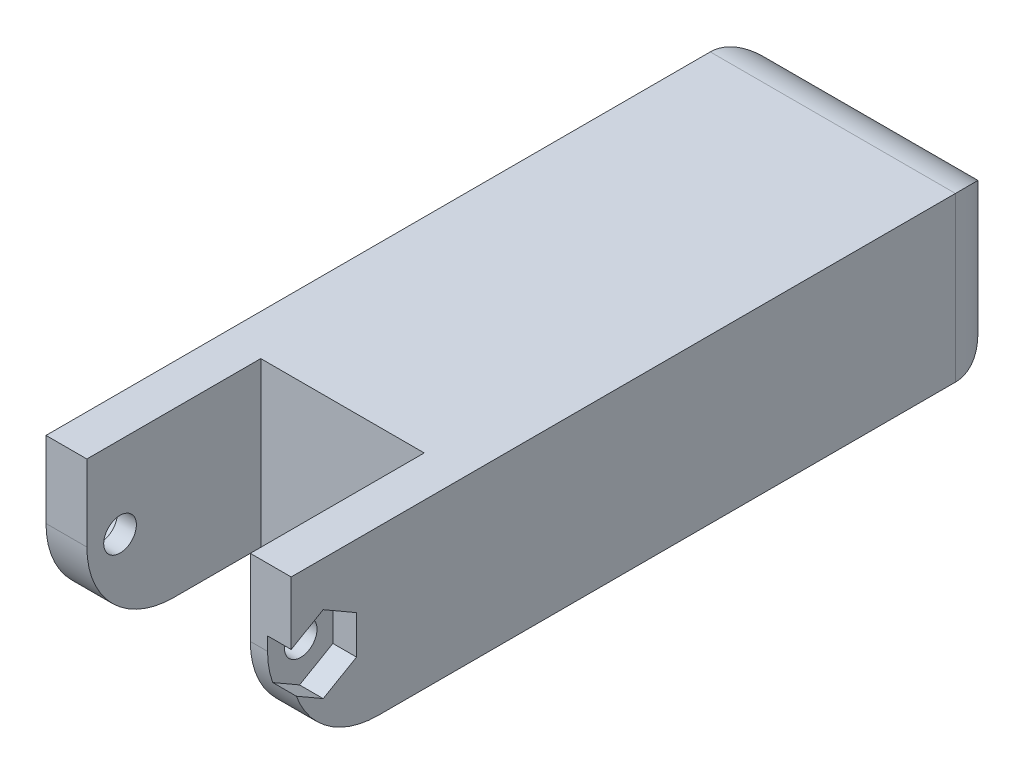
ISO-10303-21;
HEADER;
FILE_DESCRIPTION(('STEP AP214'),'2;1');
FILE_NAME('part.step','',(''),(''),'','','');
FILE_SCHEMA(('AUTOMOTIVE_DESIGN { 1 0 10303 214 1 1 1 1 }'));
ENDSEC;
DATA;
#1=APPLICATION_CONTEXT('core data for automotive mechanical design processes');
#2=APPLICATION_PROTOCOL_DEFINITION('international standard','automotive_design',2000,#1);
#3=PRODUCT_CONTEXT('',#1,'mechanical');
#4=PRODUCT('Part','Part','',(#3));
#5=PRODUCT_RELATED_PRODUCT_CATEGORY('part','',(#4));
#6=PRODUCT_DEFINITION_FORMATION('','',#4);
#7=PRODUCT_DEFINITION_CONTEXT('part definition',#1,'design');
#8=PRODUCT_DEFINITION('design','',#6,#7);
#9=PRODUCT_DEFINITION_SHAPE('','',#8);
#10=(LENGTH_UNIT() NAMED_UNIT(*) SI_UNIT(.MILLI.,.METRE.));
#11=(NAMED_UNIT(*) PLANE_ANGLE_UNIT() SI_UNIT($,.RADIAN.));
#12=(NAMED_UNIT(*) SI_UNIT($,.STERADIAN.) SOLID_ANGLE_UNIT());
#13=UNCERTAINTY_MEASURE_WITH_UNIT(LENGTH_MEASURE(1.E-05),#10,'distance_accuracy_value','');
#14=(GEOMETRIC_REPRESENTATION_CONTEXT(3) GLOBAL_UNCERTAINTY_ASSIGNED_CONTEXT((#13)) GLOBAL_UNIT_ASSIGNED_CONTEXT((#10,
#11,#12)) REPRESENTATION_CONTEXT('',''));
#15=CARTESIAN_POINT('',(0.,0.,0.));
#16=DIRECTION('',(0.,0.,1.));
#17=DIRECTION('',(1.,0.,0.));
#18=AXIS2_PLACEMENT_3D('',#15,#16,#17);
#19=CARTESIAN_POINT('',(23.75,17.5,12.9154762682217));
#20=DIRECTION('',(-1.,0.,0.));
#21=DIRECTION('',(0.,0.,1.));
#22=AXIS2_PLACEMENT_3D('',#19,#20,#21);
#23=CYLINDRICAL_SURFACE('',#22,1.5);
#24=CARTESIAN_POINT('',(7.5,17.5,12.9154762682217));
#25=DIRECTION('',(1.,0.,0.));
#26=DIRECTION('',(0.,0.,-1.));
#27=AXIS2_PLACEMENT_3D('',#24,#25,#26);
#28=CIRCLE('',#27,1.5);
#29=CARTESIAN_POINT('',(7.5,17.5,11.4154762682217));
#30=VERTEX_POINT('',#29);
#31=EDGE_CURVE('E190',#30,#30,#28,.T.);
#32=ORIENTED_EDGE('',*,*,#31,.F.);
#33=EDGE_LOOP('',(#32));
#34=FACE_BOUND('',#33,.T.);
#35=CARTESIAN_POINT('',(9.08000000000001,17.5,12.9154762682217));
#36=DIRECTION('',(1.,0.,0.));
#37=DIRECTION('',(0.,1.,0.));
#38=AXIS2_PLACEMENT_3D('',#35,#36,#37);
#39=CIRCLE('',#38,1.5);
#40=CARTESIAN_POINT('',(9.08000000000001,19.,12.9154762682217));
#41=VERTEX_POINT('',#40);
#42=EDGE_CURVE('E198',#41,#41,#39,.F.);
#43=ORIENTED_EDGE('',*,*,#42,.F.);
#44=EDGE_LOOP('',(#43));
#45=FACE_BOUND('',#44,.T.);
#46=ADVANCED_FACE('F33',(#34,#45),#23,.F.);
#47=CARTESIAN_POINT('',(-7.5,17.5,12.9154762682217));
#48=DIRECTION('',(-1.,0.,0.));
#49=DIRECTION('',(0.,0.,1.));
#50=AXIS2_PLACEMENT_3D('',#47,#48,#49);
#51=CIRCLE('',#50,1.5);
#52=CARTESIAN_POINT('',(-7.5,17.5,14.4154762682217));
#53=VERTEX_POINT('',#52);
#54=EDGE_CURVE('E193',#53,#53,#51,.T.);
#55=ORIENTED_EDGE('',*,*,#54,.F.);
#56=EDGE_LOOP('',(#55));
#57=FACE_BOUND('',#56,.T.);
#58=CARTESIAN_POINT('',(-9.25,17.5,12.9154762682217));
#59=DIRECTION('',(-1.,0.,0.));
#60=DIRECTION('',(0.,0.,1.));
#61=AXIS2_PLACEMENT_3D('',#58,#59,#60);
#62=CIRCLE('',#61,1.5);
#63=CARTESIAN_POINT('',(-9.25,17.5,14.4154762682217));
#64=VERTEX_POINT('',#63);
#65=EDGE_CURVE('E194',#64,#64,#62,.F.);
#66=ORIENTED_EDGE('',*,*,#65,.F.);
#67=EDGE_LOOP('',(#66));
#68=FACE_BOUND('',#67,.T.);
#69=ADVANCED_FACE('F395',(#57,#68),#23,.F.);
#70=CARTESIAN_POINT('',(-11.25,35.,15.96));
#71=DIRECTION('',(0.,0.,-1.));
#72=DIRECTION('',(-1.,0.,0.));
#73=AXIS2_PLACEMENT_3D('',#70,#71,#72);
#74=PLANE('',#73);
#75=DIRECTION('',(0.,-1.,0.));
#76=VECTOR('',#75,1.);
#77=CARTESIAN_POINT('',(-11.25,35.,15.96));
#78=LINE('',#77,#76);
#79=CARTESIAN_POINT('',(-11.25,25.,15.96));
#80=VERTEX_POINT('',#79);
#81=CARTESIAN_POINT('',(-11.25,18.,15.96));
#82=VERTEX_POINT('',#81);
#83=EDGE_CURVE('E179',#80,#82,#78,.T.);
#84=ORIENTED_EDGE('',*,*,#83,.T.);
#85=DIRECTION('',(1.,0.,0.));
#86=VECTOR('',#85,1.);
#87=CARTESIAN_POINT('',(-11.25,18.,15.96));
#88=LINE('',#87,#86);
#89=CARTESIAN_POINT('',(-7.5,18.,15.96));
#90=VERTEX_POINT('',#89);
#91=EDGE_CURVE('E207',#82,#90,#88,.T.);
#92=ORIENTED_EDGE('',*,*,#91,.T.);
#93=DIRECTION('',(0.,1.,0.));
#94=VECTOR('',#93,1.);
#95=CARTESIAN_POINT('',(-7.5,0.,15.96));
#96=LINE('',#95,#94);
#97=CARTESIAN_POINT('',(-7.5,25.,15.96));
#98=VERTEX_POINT('',#97);
#99=EDGE_CURVE('E180',#90,#98,#96,.T.);
#100=ORIENTED_EDGE('',*,*,#99,.T.);
#101=DIRECTION('',(1.,0.,0.));
#102=VECTOR('',#101,1.);
#103=CARTESIAN_POINT('',(-15.92,25.,15.96));
#104=LINE('',#103,#102);
#105=EDGE_CURVE('E167',#80,#98,#104,.T.);
#106=ORIENTED_EDGE('',*,*,#105,.F.);
#107=EDGE_LOOP('',(#84,#92,#100,#106));
#108=FACE_BOUND('',#107,.T.);
#109=ADVANCED_FACE('F376',(#108),#74,.F.);
#110=CARTESIAN_POINT('',(11.25,35.,-50.));
#111=DIRECTION('',(0.,0.,1.));
#112=DIRECTION('',(1.,0.,0.));
#113=AXIS2_PLACEMENT_3D('',#110,#111,#112);
#114=PLANE('',#113);
#115=DIRECTION('',(1.,0.,0.));
#116=VECTOR('',#115,1.);
#117=CARTESIAN_POINT('',(11.25,20.,-50.));
#118=LINE('',#117,#116);
#119=CARTESIAN_POINT('',(-6.25,20.,-50.));
#120=VERTEX_POINT('',#119);
#121=CARTESIAN_POINT('',(6.25,20.,-50.));
#122=VERTEX_POINT('',#121);
#123=EDGE_CURVE('E233',#120,#122,#118,.T.);
#124=ORIENTED_EDGE('',*,*,#123,.T.);
#125=DIRECTION('',(0.,-1.,0.));
#126=VECTOR('',#125,1.);
#127=CARTESIAN_POINT('',(6.25,35.,-50.));
#128=LINE('',#127,#126);
#129=CARTESIAN_POINT('',(6.25,15.,-50.));
#130=VERTEX_POINT('',#129);
#131=EDGE_CURVE('E238',#122,#130,#128,.T.);
#132=ORIENTED_EDGE('',*,*,#131,.T.);
#133=DIRECTION('',(-1.,0.,0.));
#134=VECTOR('',#133,1.);
#135=CARTESIAN_POINT('',(11.25,15.,-50.));
#136=LINE('',#135,#134);
#137=CARTESIAN_POINT('',(-6.25,15.,-50.));
#138=VERTEX_POINT('',#137);
#139=EDGE_CURVE('E235',#130,#138,#136,.T.);
#140=ORIENTED_EDGE('',*,*,#139,.T.);
#141=DIRECTION('',(0.,-1.,0.));
#142=VECTOR('',#141,1.);
#143=CARTESIAN_POINT('',(-6.25,35.,-50.));
#144=LINE('',#143,#142);
#145=EDGE_CURVE('E231',#138,#120,#144,.F.);
#146=ORIENTED_EDGE('',*,*,#145,.T.);
#147=EDGE_LOOP('',(#124,#132,#140,#146));
#148=FACE_BOUND('',#147,.T.);
#149=ADVANCED_FACE('F423',(#148),#114,.F.);
#150=CARTESIAN_POINT('',(-11.25,35.,-50.));
#151=DIRECTION('',(1.,0.,0.));
#152=DIRECTION('',(0.,0.,-1.));
#153=AXIS2_PLACEMENT_3D('',#150,#151,#152);
#154=PLANE('',#153);
#155=CARTESIAN_POINT('',(-11.25,17.5,12.9154762682217));
#156=DIRECTION('',(-1.,0.,0.));
#157=DIRECTION('',(0.,0.,1.));
#158=AXIS2_PLACEMENT_3D('',#155,#156,#157);
#159=CIRCLE('',#158,2.65);
#160=CARTESIAN_POINT('',(-11.25,17.5,15.5654762682217));
#161=VERTEX_POINT('',#160);
#162=EDGE_CURVE('E314',#161,#161,#159,.T.);
#163=ORIENTED_EDGE('',*,*,#162,.F.);
#164=EDGE_LOOP('',(#163));
#165=FACE_BOUND('',#164,.T.);
#166=DIRECTION('',(0.,0.,-1.));
#167=VECTOR('',#166,1.);
#168=CARTESIAN_POINT('',(-11.25,25.,-50.));
#169=LINE('',#168,#167);
#170=CARTESIAN_POINT('',(-11.25,25.,-45.));
#171=VERTEX_POINT('',#170);
#172=EDGE_CURVE('E267',#80,#171,#169,.T.);
#173=ORIENTED_EDGE('',*,*,#172,.T.);
#174=DIRECTION('',(0.,-1.,0.));
#175=VECTOR('',#174,1.);
#176=CARTESIAN_POINT('',(-11.25,35.,-45.));
#177=LINE('',#176,#175);
#178=CARTESIAN_POINT('',(-11.25,10.,-45.));
#179=VERTEX_POINT('',#178);
#180=EDGE_CURVE('E12',#171,#179,#177,.T.);
#181=ORIENTED_EDGE('',*,*,#180,.T.);
#182=DIRECTION('',(0.,0.,1.));
#183=VECTOR('',#182,1.);
#184=CARTESIAN_POINT('',(-11.25,10.,-50.));
#185=LINE('',#184,#183);
#186=CARTESIAN_POINT('',(-11.25,10.,7.96));
#187=VERTEX_POINT('',#186);
#188=EDGE_CURVE('E274',#179,#187,#185,.T.);
#189=ORIENTED_EDGE('',*,*,#188,.T.);
#190=CARTESIAN_POINT('',(-11.25,18.,7.96));
#191=DIRECTION('',(1.,0.,0.));
#192=DIRECTION('',(0.,0.,-1.));
#193=AXIS2_PLACEMENT_3D('',#190,#191,#192);
#194=CIRCLE('',#193,8.);
#195=EDGE_CURVE('E217',#187,#82,#194,.F.);
#196=ORIENTED_EDGE('',*,*,#195,.T.);
#197=ORIENTED_EDGE('',*,*,#83,.F.);
#198=EDGE_LOOP('',(#173,#181,#189,#196,#197));
#199=FACE_BOUND('',#198,.T.);
#200=ADVANCED_FACE('F373',(#165,#199),#154,.F.);
#201=DIRECTION('',(0.,1.,0.));
#202=VECTOR('',#201,1.);
#203=CARTESIAN_POINT('',(7.5,0.,15.96));
#204=LINE('',#203,#202);
#205=CARTESIAN_POINT('',(7.5,18.,15.96));
#206=VERTEX_POINT('',#205);
#207=CARTESIAN_POINT('',(7.5,25.,15.96));
#208=VERTEX_POINT('',#207);
#209=EDGE_CURVE('E187',#206,#208,#204,.T.);
#210=ORIENTED_EDGE('',*,*,#209,.F.);
#211=DIRECTION('',(1.,0.,0.));
#212=VECTOR('',#211,1.);
#213=CARTESIAN_POINT('',(-11.25,18.,15.96));
#214=LINE('',#213,#212);
#215=CARTESIAN_POINT('',(9.08000000000001,18.,15.96));
#216=VERTEX_POINT('',#215);
#217=EDGE_CURVE('E219',#206,#216,#214,.T.);
#218=ORIENTED_EDGE('',*,*,#217,.T.);
#219=DIRECTION('',(0.,-1.,0.));
#220=VECTOR('',#219,1.);
#221=CARTESIAN_POINT('',(9.08,35.,15.96));
#222=LINE('',#221,#220);
#223=CARTESIAN_POINT('',(9.08000000000001,19.2340086989963,15.96));
#224=VERTEX_POINT('',#223);
#225=EDGE_CURVE('E201',#224,#216,#222,.T.);
#226=ORIENTED_EDGE('',*,*,#225,.F.);
#227=DIRECTION('',(1.,0.,0.));
#228=VECTOR('',#227,1.);
#229=CARTESIAN_POINT('',(-11.25,19.2340086989963,15.96));
#230=LINE('',#229,#228);
#231=CARTESIAN_POINT('',(11.25,19.2340086989963,15.96));
#232=VERTEX_POINT('',#231);
#233=EDGE_CURVE('E178',#224,#232,#230,.T.);
#234=ORIENTED_EDGE('',*,*,#233,.T.);
#235=DIRECTION('',(0.,-1.,0.));
#236=VECTOR('',#235,1.);
#237=CARTESIAN_POINT('',(11.25,35.,15.96));
#238=LINE('',#237,#236);
#239=CARTESIAN_POINT('',(11.25,25.,15.96));
#240=VERTEX_POINT('',#239);
#241=EDGE_CURVE('E171',#240,#232,#238,.T.);
#242=ORIENTED_EDGE('',*,*,#241,.F.);
#243=EDGE_CURVE('E159',#208,#240,#104,.T.);
#244=ORIENTED_EDGE('',*,*,#243,.F.);
#245=EDGE_LOOP('',(#210,#218,#226,#234,#242,#244));
#246=FACE_BOUND('',#245,.T.);
#247=ADVANCED_FACE('F176',(#246),#74,.F.);
#248=CARTESIAN_POINT('',(11.25,35.,15.96));
#249=DIRECTION('',(-1.,0.,0.));
#250=DIRECTION('',(0.,0.,1.));
#251=AXIS2_PLACEMENT_3D('',#248,#249,#250);
#252=PLANE('',#251);
#253=DIRECTION('',(0.,0.,1.));
#254=VECTOR('',#253,1.);
#255=CARTESIAN_POINT('',(11.25,10.,15.96));
#256=LINE('',#255,#254);
#257=CARTESIAN_POINT('',(11.25,10.,-45.));
#258=VERTEX_POINT('',#257);
#259=CARTESIAN_POINT('',(11.25,10.,7.96));
#260=VERTEX_POINT('',#259);
#261=EDGE_CURVE('E173',#258,#260,#256,.T.);
#262=ORIENTED_EDGE('',*,*,#261,.F.);
#263=DIRECTION('',(0.,-1.,0.));
#264=VECTOR('',#263,1.);
#265=CARTESIAN_POINT('',(11.25,35.,-45.));
#266=LINE('',#265,#264);
#267=CARTESIAN_POINT('',(11.25,25.,-45.));
#268=VERTEX_POINT('',#267);
#269=EDGE_CURVE('E42',#258,#268,#266,.F.);
#270=ORIENTED_EDGE('',*,*,#269,.T.);
#271=DIRECTION('',(0.,0.,-1.));
#272=VECTOR('',#271,1.);
#273=CARTESIAN_POINT('',(11.25,25.,-54.1371483253101));
#274=LINE('',#273,#272);
#275=EDGE_CURVE('E161',#240,#268,#274,.T.);
#276=ORIENTED_EDGE('',*,*,#275,.F.);
#277=ORIENTED_EDGE('',*,*,#241,.T.);
#278=DIRECTION('',(0.,-0.5,0.866025403784439));
#279=VECTOR('',#278,1.);
#280=CARTESIAN_POINT('',(11.25,20.9303876106228,13.0217855361744));
#281=LINE('',#280,#279);
#282=CARTESIAN_POINT('',(11.25,20.9303876106228,13.0217855361744));
#283=VERTEX_POINT('',#282);
#284=EDGE_CURVE('E280',#283,#232,#281,.T.);
#285=ORIENTED_EDGE('',*,*,#284,.F.);
#286=DIRECTION('',(0.,0.5,0.866025403784438));
#287=VECTOR('',#286,1.);
#288=CARTESIAN_POINT('',(11.25,19.1636957869026,9.96178553617444));
#289=LINE('',#288,#287);
#290=CARTESIAN_POINT('',(11.25,19.1636957869026,9.96178553617444));
#291=VERTEX_POINT('',#290);
#292=EDGE_CURVE('E300',#291,#283,#289,.T.);
#293=ORIENTED_EDGE('',*,*,#292,.F.);
#294=DIRECTION('',(0.,1.,0.));
#295=VECTOR('',#294,1.);
#296=CARTESIAN_POINT('',(11.25,15.6303121394621,9.96178553617444));
#297=LINE('',#296,#295);
#298=CARTESIAN_POINT('',(11.25,15.6303121394621,9.96178553617444));
#299=VERTEX_POINT('',#298);
#300=EDGE_CURVE('E297',#299,#291,#297,.T.);
#301=ORIENTED_EDGE('',*,*,#300,.F.);
#302=DIRECTION('',(0.,0.5,-0.866025403784439));
#303=VECTOR('',#302,1.);
#304=CARTESIAN_POINT('',(11.25,13.8636203157418,13.0217855361744));
#305=LINE('',#304,#303);
#306=CARTESIAN_POINT('',(11.25,13.8636203157418,13.0217855361744));
#307=VERTEX_POINT('',#306);
#308=EDGE_CURVE('E294',#307,#299,#305,.T.);
#309=ORIENTED_EDGE('',*,*,#308,.F.);
#310=DIRECTION('',(0.,-0.500000000000001,-0.866025403784438));
#311=VECTOR('',#310,1.);
#312=CARTESIAN_POINT('',(11.25,15.6303121394621,16.0817855361744));
#313=LINE('',#312,#311);
#314=CARTESIAN_POINT('',(11.25,15.2861098091465,15.4856096119842));
#315=VERTEX_POINT('',#314);
#316=EDGE_CURVE('E276',#315,#307,#313,.T.);
#317=ORIENTED_EDGE('',*,*,#316,.F.);
#318=CARTESIAN_POINT('',(11.25,18.,7.96));
#319=DIRECTION('',(-1.,0.,0.));
#320=DIRECTION('',(0.,0.,1.));
#321=AXIS2_PLACEMENT_3D('',#318,#319,#320);
#322=CIRCLE('',#321,8.);
#323=EDGE_CURVE('E226',#315,#260,#322,.F.);
#324=ORIENTED_EDGE('',*,*,#323,.T.);
#325=EDGE_LOOP('',(#262,#270,#276,#277,#285,#293,#301,#309,#317,#324));
#326=FACE_BOUND('',#325,.T.);
#327=ADVANCED_FACE('F169',(#326),#252,.F.);
#328=CARTESIAN_POINT('',(-7.5,0.,15.96));
#329=DIRECTION('',(-1.,0.,0.));
#330=DIRECTION('',(0.,0.,1.));
#331=AXIS2_PLACEMENT_3D('',#328,#329,#330);
#332=PLANE('',#331);
#333=ORIENTED_EDGE('',*,*,#54,.T.);
#334=EDGE_LOOP('',(#333));
#335=FACE_BOUND('',#334,.T.);
#336=ORIENTED_EDGE('',*,*,#99,.F.);
#337=CARTESIAN_POINT('',(-7.5,18.,7.96));
#338=DIRECTION('',(-1.,0.,0.));
#339=DIRECTION('',(0.,0.,1.));
#340=AXIS2_PLACEMENT_3D('',#337,#338,#339);
#341=CIRCLE('',#340,8.);
#342=CARTESIAN_POINT('',(-7.5,10.,7.96));
#343=VERTEX_POINT('',#342);
#344=EDGE_CURVE('E210',#90,#343,#341,.F.);
#345=ORIENTED_EDGE('',*,*,#344,.T.);
#346=DIRECTION('',(0.,0.,-1.));
#347=VECTOR('',#346,1.);
#348=CARTESIAN_POINT('',(-7.5,10.,15.96));
#349=LINE('',#348,#347);
#350=CARTESIAN_POINT('',(-7.5,10.,0.));
#351=VERTEX_POINT('',#350);
#352=EDGE_CURVE('E272',#343,#351,#349,.T.);
#353=ORIENTED_EDGE('',*,*,#352,.T.);
#354=DIRECTION('',(0.,1.,0.));
#355=VECTOR('',#354,1.);
#356=CARTESIAN_POINT('',(-7.5,0.,0.));
#357=LINE('',#356,#355);
#358=CARTESIAN_POINT('',(-7.5,25.,0.));
#359=VERTEX_POINT('',#358);
#360=EDGE_CURVE('E184',#351,#359,#357,.T.);
#361=ORIENTED_EDGE('',*,*,#360,.T.);
#362=DIRECTION('',(0.,0.,1.));
#363=VECTOR('',#362,1.);
#364=CARTESIAN_POINT('',(-7.5,25.,15.96));
#365=LINE('',#364,#363);
#366=EDGE_CURVE('E264',#359,#98,#365,.T.);
#367=ORIENTED_EDGE('',*,*,#366,.T.);
#368=EDGE_LOOP('',(#336,#345,#353,#361,#367));
#369=FACE_BOUND('',#368,.T.);
#370=ADVANCED_FACE('F365',(#335,#369),#332,.F.);
#371=CARTESIAN_POINT('',(-7.5,0.,0.));
#372=DIRECTION('',(0.,0.,-1.));
#373=DIRECTION('',(-1.,0.,0.));
#374=AXIS2_PLACEMENT_3D('',#371,#372,#373);
#375=PLANE('',#374);
#376=ORIENTED_EDGE('',*,*,#360,.F.);
#377=DIRECTION('',(1.,0.,0.));
#378=VECTOR('',#377,1.);
#379=CARTESIAN_POINT('',(-7.5,10.,0.));
#380=LINE('',#379,#378);
#381=CARTESIAN_POINT('',(7.5,10.,0.));
#382=VERTEX_POINT('',#381);
#383=EDGE_CURVE('E269',#351,#382,#380,.T.);
#384=ORIENTED_EDGE('',*,*,#383,.T.);
#385=DIRECTION('',(0.,1.,0.));
#386=VECTOR('',#385,1.);
#387=CARTESIAN_POINT('',(7.5,0.,0.));
#388=LINE('',#387,#386);
#389=CARTESIAN_POINT('',(7.5,25.,0.));
#390=VERTEX_POINT('',#389);
#391=EDGE_CURVE('E322',#382,#390,#388,.T.);
#392=ORIENTED_EDGE('',*,*,#391,.T.);
#393=DIRECTION('',(-1.,0.,0.));
#394=VECTOR('',#393,1.);
#395=CARTESIAN_POINT('',(-7.5,25.,0.));
#396=LINE('',#395,#394);
#397=EDGE_CURVE('E261',#390,#359,#396,.T.);
#398=ORIENTED_EDGE('',*,*,#397,.T.);
#399=EDGE_LOOP('',(#376,#384,#392,#398));
#400=FACE_BOUND('',#399,.T.);
#401=ADVANCED_FACE('F362',(#400),#375,.F.);
#402=CARTESIAN_POINT('',(7.5,0.,0.));
#403=DIRECTION('',(1.,0.,0.));
#404=DIRECTION('',(0.,0.,-1.));
#405=AXIS2_PLACEMENT_3D('',#402,#403,#404);
#406=PLANE('',#405);
#407=ORIENTED_EDGE('',*,*,#31,.T.);
#408=EDGE_LOOP('',(#407));
#409=FACE_BOUND('',#408,.T.);
#410=DIRECTION('',(0.,0.,1.));
#411=VECTOR('',#410,1.);
#412=CARTESIAN_POINT('',(7.5,10.,0.));
#413=LINE('',#412,#411);
#414=CARTESIAN_POINT('',(7.5,10.,7.96));
#415=VERTEX_POINT('',#414);
#416=EDGE_CURVE('E204',#382,#415,#413,.T.);
#417=ORIENTED_EDGE('',*,*,#416,.T.);
#418=CARTESIAN_POINT('',(7.5,18.,7.96));
#419=DIRECTION('',(1.,0.,0.));
#420=DIRECTION('',(0.,0.,-1.));
#421=AXIS2_PLACEMENT_3D('',#418,#419,#420);
#422=CIRCLE('',#421,8.);
#423=EDGE_CURVE('E229',#415,#206,#422,.F.);
#424=ORIENTED_EDGE('',*,*,#423,.T.);
#425=ORIENTED_EDGE('',*,*,#209,.T.);
#426=DIRECTION('',(0.,0.,-1.));
#427=VECTOR('',#426,1.);
#428=CARTESIAN_POINT('',(7.5,25.,0.));
#429=LINE('',#428,#427);
#430=EDGE_CURVE('E163',#208,#390,#429,.T.);
#431=ORIENTED_EDGE('',*,*,#430,.T.);
#432=ORIENTED_EDGE('',*,*,#391,.F.);
#433=EDGE_LOOP('',(#417,#424,#425,#431,#432));
#434=FACE_BOUND('',#433,.T.);
#435=ADVANCED_FACE('F327',(#409,#434),#406,.F.);
#436=CARTESIAN_POINT('',(-9.25,17.5,12.9154762682217));
#437=DIRECTION('',(-1.,0.,0.));
#438=DIRECTION('',(0.,0.,1.));
#439=AXIS2_PLACEMENT_3D('',#436,#437,#438);
#440=PLANE('',#439);
#441=CARTESIAN_POINT('',(-9.25,17.5,12.9154762682217));
#442=DIRECTION('',(-1.,0.,0.));
#443=DIRECTION('',(0.,0.,1.));
#444=AXIS2_PLACEMENT_3D('',#441,#442,#443);
#445=CIRCLE('',#444,2.65);
#446=CARTESIAN_POINT('',(-9.25,17.5,15.5654762682217));
#447=VERTEX_POINT('',#446);
#448=EDGE_CURVE('E197',#447,#447,#445,.T.);
#449=ORIENTED_EDGE('',*,*,#448,.T.);
#450=EDGE_LOOP('',(#449));
#451=FACE_BOUND('',#450,.T.);
#452=ORIENTED_EDGE('',*,*,#65,.T.);
#453=EDGE_LOOP('',(#452));
#454=FACE_BOUND('',#453,.T.);
#455=ADVANCED_FACE('F415',(#451,#454),#440,.T.);
#456=CARTESIAN_POINT('',(-9.25,17.5,12.9154762682217));
#457=DIRECTION('',(-1.,0.,0.));
#458=DIRECTION('',(0.,0.,1.));
#459=AXIS2_PLACEMENT_3D('',#456,#457,#458);
#460=CYLINDRICAL_SURFACE('',#459,2.65);
#461=ORIENTED_EDGE('',*,*,#448,.F.);
#462=EDGE_LOOP('',(#461));
#463=FACE_BOUND('',#462,.T.);
#464=ORIENTED_EDGE('',*,*,#162,.T.);
#465=EDGE_LOOP('',(#464));
#466=FACE_BOUND('',#465,.T.);
#467=ADVANCED_FACE('F406',(#463,#466),#460,.F.);
#468=CARTESIAN_POINT('',(9.08000000000001,15.6303121394621,16.0817855361744));
#469=DIRECTION('',(0.,-0.866025403784438,0.500000000000001));
#470=DIRECTION('',(0.,-0.500000000000001,-0.866025403784438));
#471=AXIS2_PLACEMENT_3D('',#468,#469,#470);
#472=PLANE('',#471);
#473=DIRECTION('',(0.,-0.500000000000001,-0.866025403784438));
#474=VECTOR('',#473,1.);
#475=CARTESIAN_POINT('',(9.08000000000001,15.6303121394621,16.0817855361744));
#476=LINE('',#475,#474);
#477=CARTESIAN_POINT('',(9.08000000000001,15.2861098091465,15.4856096119842));
#478=VERTEX_POINT('',#477);
#479=CARTESIAN_POINT('',(9.08000000000001,13.8636203157418,13.0217855361744));
#480=VERTEX_POINT('',#479);
#481=EDGE_CURVE('E277',#478,#480,#476,.T.);
#482=ORIENTED_EDGE('',*,*,#481,.F.);
#483=DIRECTION('',(1.,0.,0.));
#484=VECTOR('',#483,1.);
#485=CARTESIAN_POINT('',(9.08000000000001,15.2861098091465,15.4856096119842));
#486=LINE('',#485,#484);
#487=EDGE_CURVE('E224',#478,#315,#486,.T.);
#488=ORIENTED_EDGE('',*,*,#487,.T.);
#489=ORIENTED_EDGE('',*,*,#316,.T.);
#490=DIRECTION('',(1.,0.,0.));
#491=VECTOR('',#490,1.);
#492=CARTESIAN_POINT('',(9.08000000000001,13.8636203157418,13.0217855361744));
#493=LINE('',#492,#491);
#494=EDGE_CURVE('E292',#480,#307,#493,.T.);
#495=ORIENTED_EDGE('',*,*,#494,.F.);
#496=EDGE_LOOP('',(#482,#488,#489,#495));
#497=FACE_BOUND('',#496,.T.);
#498=ADVANCED_FACE('F340',(#497),#472,.F.);
#499=CARTESIAN_POINT('',(9.08000000000001,20.9303876106228,13.0217855361744));
#500=DIRECTION('',(0.,0.866025403784439,0.5));
#501=DIRECTION('',(0.,-0.5,0.866025403784439));
#502=AXIS2_PLACEMENT_3D('',#499,#500,#501);
#503=PLANE('',#502);
#504=DIRECTION('',(0.,-0.5,0.866025403784439));
#505=VECTOR('',#504,1.);
#506=CARTESIAN_POINT('',(9.08000000000001,20.9303876106228,13.0217855361744));
#507=LINE('',#506,#505);
#508=CARTESIAN_POINT('',(9.08000000000001,20.9303876106228,13.0217855361744));
#509=VERTEX_POINT('',#508);
#510=EDGE_CURVE('E289',#509,#224,#507,.T.);
#511=ORIENTED_EDGE('',*,*,#510,.F.);
#512=DIRECTION('',(1.,0.,0.));
#513=VECTOR('',#512,1.);
#514=CARTESIAN_POINT('',(9.08000000000001,20.9303876106228,13.0217855361744));
#515=LINE('',#514,#513);
#516=EDGE_CURVE('E202',#509,#283,#515,.T.);
#517=ORIENTED_EDGE('',*,*,#516,.T.);
#518=ORIENTED_EDGE('',*,*,#284,.T.);
#519=ORIENTED_EDGE('',*,*,#233,.F.);
#520=EDGE_LOOP('',(#511,#517,#518,#519));
#521=FACE_BOUND('',#520,.T.);
#522=ADVANCED_FACE('F356',(#521),#503,.F.);
#523=CARTESIAN_POINT('',(9.08000000000001,0.,0.));
#524=DIRECTION('',(1.,0.,0.));
#525=DIRECTION('',(0.,1.,0.));
#526=AXIS2_PLACEMENT_3D('',#523,#524,#525);
#527=PLANE('',#526);
#528=ORIENTED_EDGE('',*,*,#42,.T.);
#529=EDGE_LOOP('',(#528));
#530=FACE_BOUND('',#529,.T.);
#531=ORIENTED_EDGE('',*,*,#225,.T.);
#532=CARTESIAN_POINT('',(9.08000000000001,18.,7.96));
#533=DIRECTION('',(1.,0.,0.));
#534=DIRECTION('',(0.,1.,0.));
#535=AXIS2_PLACEMENT_3D('',#532,#533,#534);
#536=CIRCLE('',#535,8.);
#537=EDGE_CURVE('E222',#216,#478,#536,.T.);
#538=ORIENTED_EDGE('',*,*,#537,.T.);
#539=ORIENTED_EDGE('',*,*,#481,.T.);
#540=DIRECTION('',(0.,0.5,-0.866025403784439));
#541=VECTOR('',#540,1.);
#542=CARTESIAN_POINT('',(9.08000000000001,13.8636203157418,13.0217855361744));
#543=LINE('',#542,#541);
#544=CARTESIAN_POINT('',(9.08000000000001,15.6303121394621,9.96178553617444));
#545=VERTEX_POINT('',#544);
#546=EDGE_CURVE('E279',#480,#545,#543,.T.);
#547=ORIENTED_EDGE('',*,*,#546,.T.);
#548=DIRECTION('',(0.,1.,0.));
#549=VECTOR('',#548,1.);
#550=CARTESIAN_POINT('',(9.08000000000001,15.6303121394621,9.96178553617444));
#551=LINE('',#550,#549);
#552=CARTESIAN_POINT('',(9.08000000000001,19.1636957869026,9.96178553617444));
#553=VERTEX_POINT('',#552);
#554=EDGE_CURVE('E283',#545,#553,#551,.T.);
#555=ORIENTED_EDGE('',*,*,#554,.T.);
#556=DIRECTION('',(0.,0.5,0.866025403784438));
#557=VECTOR('',#556,1.);
#558=CARTESIAN_POINT('',(9.08000000000001,19.1636957869026,9.96178553617444));
#559=LINE('',#558,#557);
#560=EDGE_CURVE('E286',#553,#509,#559,.T.);
#561=ORIENTED_EDGE('',*,*,#560,.T.);
#562=ORIENTED_EDGE('',*,*,#510,.T.);
#563=EDGE_LOOP('',(#531,#538,#539,#547,#555,#561,#562));
#564=FACE_BOUND('',#563,.T.);
#565=ADVANCED_FACE('F337',(#530,#564),#527,.T.);
#566=CARTESIAN_POINT('',(9.08000000000001,19.1636957869026,9.96178553617444));
#567=DIRECTION('',(0.,0.866025403784438,-0.5));
#568=DIRECTION('',(0.,0.5,0.866025403784439));
#569=AXIS2_PLACEMENT_3D('',#566,#567,#568);
#570=PLANE('',#569);
#571=ORIENTED_EDGE('',*,*,#292,.T.);
#572=ORIENTED_EDGE('',*,*,#516,.F.);
#573=ORIENTED_EDGE('',*,*,#560,.F.);
#574=DIRECTION('',(1.,0.,0.));
#575=VECTOR('',#574,1.);
#576=CARTESIAN_POINT('',(9.08000000000001,19.1636957869026,9.96178553617444));
#577=LINE('',#576,#575);
#578=EDGE_CURVE('E305',#553,#291,#577,.T.);
#579=ORIENTED_EDGE('',*,*,#578,.T.);
#580=EDGE_LOOP('',(#571,#572,#573,#579));
#581=FACE_BOUND('',#580,.T.);
#582=ADVANCED_FACE('F353',(#581),#570,.F.);
#583=CARTESIAN_POINT('',(9.08000000000001,15.6303121394621,9.96178553617444));
#584=DIRECTION('',(0.,0.,-1.));
#585=DIRECTION('',(-1.,0.,0.));
#586=AXIS2_PLACEMENT_3D('',#583,#584,#585);
#587=PLANE('',#586);
#588=ORIENTED_EDGE('',*,*,#300,.T.);
#589=ORIENTED_EDGE('',*,*,#578,.F.);
#590=ORIENTED_EDGE('',*,*,#554,.F.);
#591=DIRECTION('',(1.,0.,0.));
#592=VECTOR('',#591,1.);
#593=CARTESIAN_POINT('',(9.08000000000001,15.6303121394621,9.96178553617444));
#594=LINE('',#593,#592);
#595=EDGE_CURVE('E307',#545,#299,#594,.T.);
#596=ORIENTED_EDGE('',*,*,#595,.T.);
#597=EDGE_LOOP('',(#588,#589,#590,#596));
#598=FACE_BOUND('',#597,.T.);
#599=ADVANCED_FACE('F349',(#598),#587,.F.);
#600=CARTESIAN_POINT('',(9.08000000000001,13.8636203157418,13.0217855361744));
#601=DIRECTION('',(0.,-0.866025403784439,-0.5));
#602=DIRECTION('',(0.,0.5,-0.866025403784439));
#603=AXIS2_PLACEMENT_3D('',#600,#601,#602);
#604=PLANE('',#603);
#605=ORIENTED_EDGE('',*,*,#308,.T.);
#606=ORIENTED_EDGE('',*,*,#595,.F.);
#607=ORIENTED_EDGE('',*,*,#546,.F.);
#608=ORIENTED_EDGE('',*,*,#494,.T.);
#609=EDGE_LOOP('',(#605,#606,#607,#608));
#610=FACE_BOUND('',#609,.T.);
#611=ADVANCED_FACE('F345',(#610),#604,.F.);
#612=CARTESIAN_POINT('',(-15.92,25.,-54.1371483253101));
#613=DIRECTION('',(0.,-1.,0.));
#614=DIRECTION('',(0.,0.,-1.));
#615=AXIS2_PLACEMENT_3D('',#612,#613,#614);
#616=PLANE('',#615);
#617=ORIENTED_EDGE('',*,*,#275,.T.);
#618=DIRECTION('',(1.,0.,0.));
#619=VECTOR('',#618,1.);
#620=CARTESIAN_POINT('',(-15.92,25.,-45.));
#621=LINE('',#620,#619);
#622=EDGE_CURVE('E56',#268,#171,#621,.F.);
#623=ORIENTED_EDGE('',*,*,#622,.T.);
#624=ORIENTED_EDGE('',*,*,#172,.F.);
#625=ORIENTED_EDGE('',*,*,#105,.T.);
#626=ORIENTED_EDGE('',*,*,#366,.F.);
#627=ORIENTED_EDGE('',*,*,#397,.F.);
#628=ORIENTED_EDGE('',*,*,#430,.F.);
#629=ORIENTED_EDGE('',*,*,#243,.T.);
#630=EDGE_LOOP('',(#617,#623,#624,#625,#626,#627,#628,#629));
#631=FACE_BOUND('',#630,.T.);
#632=ADVANCED_FACE('F160',(#631),#616,.F.);
#633=CARTESIAN_POINT('',(-15.92,10.,15.96));
#634=DIRECTION('',(0.,1.,0.));
#635=DIRECTION('',(0.,0.,1.));
#636=AXIS2_PLACEMENT_3D('',#633,#634,#635);
#637=PLANE('',#636);
#638=ORIENTED_EDGE('',*,*,#188,.F.);
#639=DIRECTION('',(-1.,0.,0.));
#640=VECTOR('',#639,1.);
#641=CARTESIAN_POINT('',(-15.92,10.,-45.));
#642=LINE('',#641,#640);
#643=EDGE_CURVE('E240',#179,#258,#642,.F.);
#644=ORIENTED_EDGE('',*,*,#643,.T.);
#645=ORIENTED_EDGE('',*,*,#261,.T.);
#646=DIRECTION('',(1.,0.,0.));
#647=VECTOR('',#646,1.);
#648=CARTESIAN_POINT('',(-15.92,10.,7.96));
#649=LINE('',#648,#647);
#650=EDGE_CURVE('E212',#260,#415,#649,.F.);
#651=ORIENTED_EDGE('',*,*,#650,.T.);
#652=ORIENTED_EDGE('',*,*,#416,.F.);
#653=ORIENTED_EDGE('',*,*,#383,.F.);
#654=ORIENTED_EDGE('',*,*,#352,.F.);
#655=DIRECTION('',(1.,0.,0.));
#656=VECTOR('',#655,1.);
#657=CARTESIAN_POINT('',(-15.92,10.,7.96));
#658=LINE('',#657,#656);
#659=EDGE_CURVE('E214',#343,#187,#658,.F.);
#660=ORIENTED_EDGE('',*,*,#659,.T.);
#661=EDGE_LOOP('',(#638,#644,#645,#651,#652,#653,#654,#660));
#662=FACE_BOUND('',#661,.T.);
#663=ADVANCED_FACE('F358',(#662),#637,.F.);
#664=CARTESIAN_POINT('',(-11.25,18.,7.96));
#665=DIRECTION('',(1.,0.,0.));
#666=DIRECTION('',(0.,1.,0.));
#667=AXIS2_PLACEMENT_3D('',#664,#665,#666);
#668=CYLINDRICAL_SURFACE('',#667,8.);
#669=ORIENTED_EDGE('',*,*,#195,.F.);
#670=ORIENTED_EDGE('',*,*,#659,.F.);
#671=ORIENTED_EDGE('',*,*,#344,.F.);
#672=ORIENTED_EDGE('',*,*,#91,.F.);
#673=EDGE_LOOP('',(#669,#670,#671,#672));
#674=FACE_BOUND('',#673,.T.);
#675=ADVANCED_FACE('F369',(#674),#668,.T.);
#676=CARTESIAN_POINT('',(-11.25,18.,7.96));
#677=DIRECTION('',(1.,0.,0.));
#678=DIRECTION('',(0.,1.,0.));
#679=AXIS2_PLACEMENT_3D('',#676,#677,#678);
#680=CYLINDRICAL_SURFACE('',#679,8.);
#681=ORIENTED_EDGE('',*,*,#423,.F.);
#682=ORIENTED_EDGE('',*,*,#650,.F.);
#683=ORIENTED_EDGE('',*,*,#323,.F.);
#684=ORIENTED_EDGE('',*,*,#487,.F.);
#685=ORIENTED_EDGE('',*,*,#537,.F.);
#686=ORIENTED_EDGE('',*,*,#217,.F.);
#687=EDGE_LOOP('',(#681,#682,#683,#684,#685,#686));
#688=FACE_BOUND('',#687,.T.);
#689=ADVANCED_FACE('F331',(#688),#680,.T.);
#690=CARTESIAN_POINT('',(11.25,20.,-45.));
#691=DIRECTION('',(1.,0.,0.));
#692=DIRECTION('',(0.,0.,-1.));
#693=AXIS2_PLACEMENT_3D('',#690,#691,#692);
#694=CYLINDRICAL_SURFACE('',#693,5.);
#695=CARTESIAN_POINT('',(-6.25,20.,-45.));
#696=DIRECTION('',(-0.707106781186547,-0.707106781186547,0.));
#697=DIRECTION('',(0.707106781186547,-0.707106781186547,0.));
#698=AXIS2_PLACEMENT_3D('',#695,#696,#697);
#699=ELLIPSE('',#698,7.07106781186547,5.);
#700=EDGE_CURVE('E248',#171,#120,#699,.T.);
#701=ORIENTED_EDGE('',*,*,#700,.F.);
#702=ORIENTED_EDGE('',*,*,#622,.F.);
#703=CARTESIAN_POINT('',(6.25,20.,-45.));
#704=DIRECTION('',(0.707106781186547,-0.707106781186547,0.));
#705=DIRECTION('',(-0.707106781186547,-0.707106781186547,0.));
#706=AXIS2_PLACEMENT_3D('',#703,#704,#705);
#707=ELLIPSE('',#706,7.07106781186547,5.);
#708=EDGE_CURVE('E37',#122,#268,#707,.T.);
#709=ORIENTED_EDGE('',*,*,#708,.F.);
#710=ORIENTED_EDGE('',*,*,#123,.F.);
#711=EDGE_LOOP('',(#701,#702,#709,#710));
#712=FACE_BOUND('',#711,.T.);
#713=ADVANCED_FACE('F35',(#712),#694,.T.);
#714=CARTESIAN_POINT('',(6.25,35.,-45.));
#715=DIRECTION('',(0.,-1.,0.));
#716=DIRECTION('',(0.,0.,-1.));
#717=AXIS2_PLACEMENT_3D('',#714,#715,#716);
#718=CYLINDRICAL_SURFACE('',#717,5.);
#719=ORIENTED_EDGE('',*,*,#708,.T.);
#720=ORIENTED_EDGE('',*,*,#269,.F.);
#721=CARTESIAN_POINT('',(6.25,15.,-45.));
#722=DIRECTION('',(-0.707106781186547,-0.707106781186547,0.));
#723=DIRECTION('',(0.707106781186547,-0.707106781186547,0.));
#724=AXIS2_PLACEMENT_3D('',#721,#722,#723);
#725=ELLIPSE('',#724,7.07106781186547,5.);
#726=EDGE_CURVE('E247',#130,#258,#725,.T.);
#727=ORIENTED_EDGE('',*,*,#726,.F.);
#728=ORIENTED_EDGE('',*,*,#131,.F.);
#729=EDGE_LOOP('',(#719,#720,#727,#728));
#730=FACE_BOUND('',#729,.T.);
#731=ADVANCED_FACE('F387',(#730),#718,.T.);
#732=CARTESIAN_POINT('',(-6.25,35.,-45.));
#733=DIRECTION('',(0.,-1.,0.));
#734=DIRECTION('',(0.,0.,-1.));
#735=AXIS2_PLACEMENT_3D('',#732,#733,#734);
#736=CYLINDRICAL_SURFACE('',#735,5.);
#737=ORIENTED_EDGE('',*,*,#700,.T.);
#738=ORIENTED_EDGE('',*,*,#145,.F.);
#739=CARTESIAN_POINT('',(-6.25,15.,-45.));
#740=DIRECTION('',(0.707106781186547,-0.707106781186547,0.));
#741=DIRECTION('',(-0.707106781186547,-0.707106781186547,0.));
#742=AXIS2_PLACEMENT_3D('',#739,#740,#741);
#743=ELLIPSE('',#742,7.07106781186547,5.);
#744=EDGE_CURVE('E245',#179,#138,#743,.T.);
#745=ORIENTED_EDGE('',*,*,#744,.F.);
#746=ORIENTED_EDGE('',*,*,#180,.F.);
#747=EDGE_LOOP('',(#737,#738,#745,#746));
#748=FACE_BOUND('',#747,.T.);
#749=ADVANCED_FACE('F381',(#748),#736,.T.);
#750=CARTESIAN_POINT('',(11.25,15.,-45.));
#751=DIRECTION('',(-1.,0.,0.));
#752=DIRECTION('',(0.,-1.,0.));
#753=AXIS2_PLACEMENT_3D('',#750,#751,#752);
#754=CYLINDRICAL_SURFACE('',#753,5.);
#755=ORIENTED_EDGE('',*,*,#726,.T.);
#756=ORIENTED_EDGE('',*,*,#643,.F.);
#757=ORIENTED_EDGE('',*,*,#744,.T.);
#758=ORIENTED_EDGE('',*,*,#139,.F.);
#759=EDGE_LOOP('',(#755,#756,#757,#758));
#760=FACE_BOUND('',#759,.T.);
#761=ADVANCED_FACE('F385',(#760),#754,.T.);
#762=CLOSED_SHELL('',(#46,#69,#109,#149,#200,#247,#327,#370,#401,#435,#455,#467,#498,#522,#565,
#582,#599,#611,#632,#663,#675,#689,#713,#731,#749,#761));
#763=MANIFOLD_SOLID_BREP('B2',#762);
#764=ADVANCED_BREP_SHAPE_REPRESENTATION('',(#18,#763),#14);
#765=SHAPE_DEFINITION_REPRESENTATION(#9,#764);
ENDSEC;
END-ISO-10303-21;
